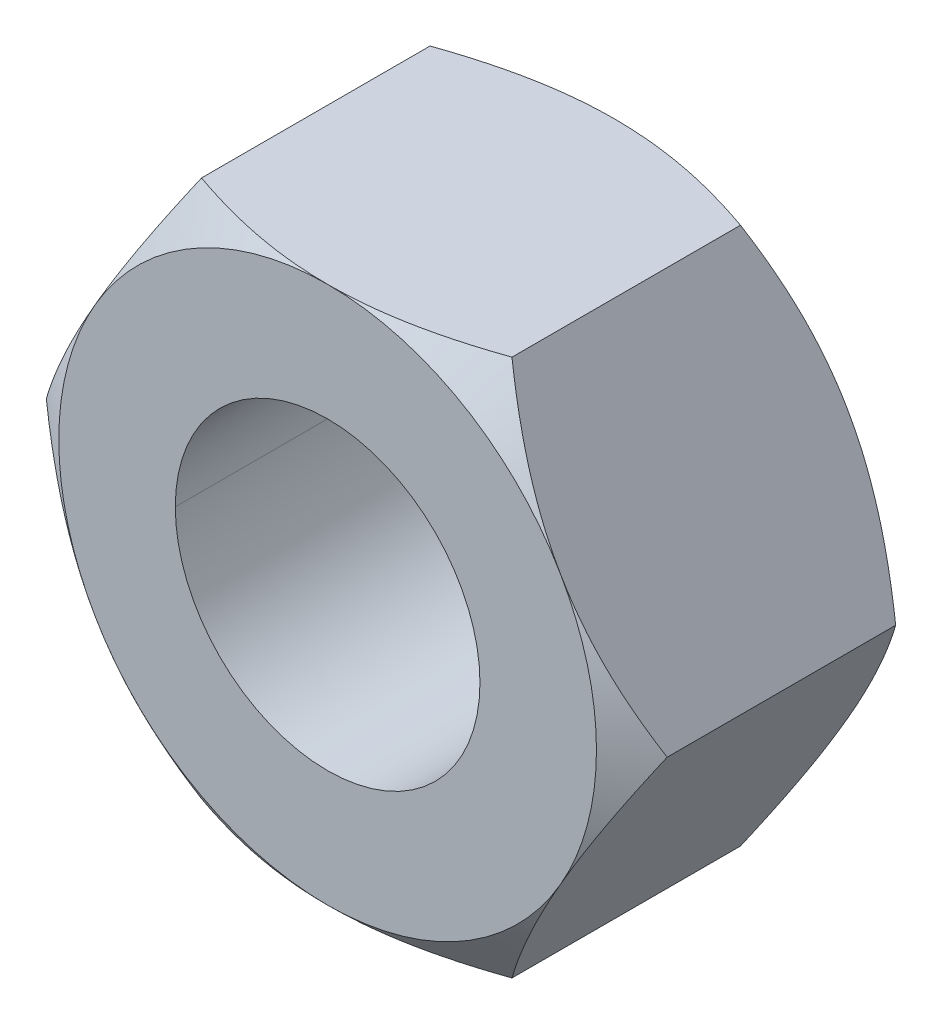
ISO-10303-21;
HEADER;
FILE_DESCRIPTION(('STEP AP214'),'2;1');
FILE_NAME('part.step','',(''),(''),'','','');
FILE_SCHEMA(('AUTOMOTIVE_DESIGN { 1 0 10303 214 1 1 1 1 }'));
ENDSEC;
DATA;
#1=APPLICATION_CONTEXT('core data for automotive mechanical design processes');
#2=APPLICATION_PROTOCOL_DEFINITION('international standard','automotive_design',2000,#1);
#3=PRODUCT_CONTEXT('',#1,'mechanical');
#4=PRODUCT('Part','Part','',(#3));
#5=PRODUCT_RELATED_PRODUCT_CATEGORY('part','',(#4));
#6=PRODUCT_DEFINITION_FORMATION('','',#4);
#7=PRODUCT_DEFINITION_CONTEXT('part definition',#1,'design');
#8=PRODUCT_DEFINITION('design','',#6,#7);
#9=PRODUCT_DEFINITION_SHAPE('','',#8);
#10=(LENGTH_UNIT() NAMED_UNIT(*) SI_UNIT(.MILLI.,.METRE.));
#11=(NAMED_UNIT(*) PLANE_ANGLE_UNIT() SI_UNIT($,.RADIAN.));
#12=(NAMED_UNIT(*) SI_UNIT($,.STERADIAN.) SOLID_ANGLE_UNIT());
#13=UNCERTAINTY_MEASURE_WITH_UNIT(LENGTH_MEASURE(1.E-05),#10,'distance_accuracy_value','');
#14=(GEOMETRIC_REPRESENTATION_CONTEXT(3) GLOBAL_UNCERTAINTY_ASSIGNED_CONTEXT((#13)) GLOBAL_UNIT_ASSIGNED_CONTEXT((#10,
#11,#12)) REPRESENTATION_CONTEXT('',''));
#15=CARTESIAN_POINT('',(0.,0.,0.));
#16=DIRECTION('',(0.,0.,1.));
#17=DIRECTION('',(1.,0.,0.));
#18=AXIS2_PLACEMENT_3D('',#15,#16,#17);
#19=CARTESIAN_POINT('',(1.732050807569,0.,0.08124186235412));
#20=DIRECTION('',(0.,0.,1.));
#21=DIRECTION('',(-1.,0.,0.));
#22=AXIS2_PLACEMENT_3D('',#19,#20,#21);
#23=CONICAL_SURFACE('',#22,1.616025403784,0.9599310885967);
#24=CARTESIAN_POINT('',(1.732050807611,1.5,2.086235252517E-13));
#25=CARTESIAN_POINT('',(1.52330238576711,1.5,2.086235252517E-13));
#26=CARTESIAN_POINT('',(1.30632687304829,1.5,0.0414770288528725));
#27=CARTESIAN_POINT('',(1.09779716156328,1.5,0.0813395587371093));
#28=CARTESIAN_POINT('',(0.8660254037845,1.5,0.1624837247076));
#29=B_SPLINE_CURVE_WITH_KNOTS('',2,(#24,#25,#26,#27,#28),.UNSPECIFIED.,.F.,.F.,(3,2,3),(0.,0.5,
1.),.UNSPECIFIED.);
#30=CARTESIAN_POINT('',(1.732050807597,1.5,3.814726312612E-13));
#31=VERTEX_POINT('',#30);
#32=CARTESIAN_POINT('',(0.8660254037845,1.5,0.1624837247076));
#33=VERTEX_POINT('',#32);
#34=EDGE_CURVE('E199',#31,#33,#29,.T.);
#35=ORIENTED_EDGE('',*,*,#34,.F.);
#36=CARTESIAN_POINT('',(1.732050807569,0.,4.285460875053E-13));
#37=DIRECTION('',(0.,0.,1.));
#38=DIRECTION('',(1.873005454437E-11,1.,0.));
#39=AXIS2_PLACEMENT_3D('',#36,#37,#38);
#40=CIRCLE('',#39,1.5);
#41=CARTESIAN_POINT('',(0.4330127019168,0.7500000000421,4.349853810481E-13));
#42=VERTEX_POINT('',#41);
#43=EDGE_CURVE('E268',#31,#42,#40,.T.);
#44=ORIENTED_EDGE('',*,*,#43,.T.);
#45=CARTESIAN_POINT('',(0.866025403784425,1.50000000000004,0.1624837247076));
#46=CARTESIAN_POINT('',(0.750302519965854,1.2995620856279,0.0814536891150306));
#47=CARTESIAN_POINT('',(0.64566544695967,1.1183253588259,0.0413974797374313));
#48=CARTESIAN_POINT('',(0.537524632418271,0.931019973668323,2.22017499870719E-13));
#49=CARTESIAN_POINT('',(0.433012701916569,0.750000000042275,2.220155437577E-13));
#50=B_SPLINE_CURVE_WITH_KNOTS('',2,(#45,#46,#47,#48,#49),.UNSPECIFIED.,.F.,.F.,(3,2,3),(0.,0.5,
1.),.UNSPECIFIED.);
#51=EDGE_CURVE('E203',#33,#42,#50,.T.);
#52=ORIENTED_EDGE('',*,*,#51,.F.);
#53=EDGE_LOOP('',(#35,#44,#52));
#54=FACE_BOUND('',#53,.T.);
#55=ADVANCED_FACE('F16',(#54),#23,.T.);
#56=CARTESIAN_POINT('',(1.732050807569,0.,0.08124186235399));
#57=DIRECTION('',(0.,0.,1.));
#58=DIRECTION('',(-1.,0.,0.));
#59=AXIS2_PLACEMENT_3D('',#56,#57,#58);
#60=CONICAL_SURFACE('',#59,1.616025403784,0.9599310885967);
#61=CARTESIAN_POINT('',(3.0310889132574,0.749999999979833,2.103710835714E-13));
#62=CARTESIAN_POINT('',(2.9267147023445,0.930781436280886,2.103710835714E-13));
#63=CARTESIAN_POINT('',(2.81822694598485,1.11868774229494,0.0414770288528081));
#64=CARTESIAN_POINT('',(2.71396209024344,1.2992797698829,0.0813395587364784));
#65=CARTESIAN_POINT('',(2.59807621135339,1.50000000000023,0.1624837247075));
#66=B_SPLINE_CURVE_WITH_KNOTS('',2,(#61,#62,#63,#64,#65),.UNSPECIFIED.,.F.,.F.,(3,2,3),(0.,0.5,
1.),.UNSPECIFIED.);
#67=CARTESIAN_POINT('',(3.031088913256,0.7499999999822,4.35429470258E-13));
#68=VERTEX_POINT('',#67);
#69=CARTESIAN_POINT('',(2.598076211353,1.5,0.1624837247075));
#70=VERTEX_POINT('',#69);
#71=EDGE_CURVE('E590',#68,#70,#66,.T.);
#72=ORIENTED_EDGE('',*,*,#71,.F.);
#73=CARTESIAN_POINT('',(1.732050807569,0.,3.814726312612E-13));
#74=DIRECTION('',(0.,0.,1.));
#75=DIRECTION('',(0.866025403791264,0.499999999988179,0.));
#76=AXIS2_PLACEMENT_3D('',#73,#74,#75);
#77=CIRCLE('',#76,1.5);
#78=EDGE_CURVE('E898',#68,#31,#77,.T.);
#79=ORIENTED_EDGE('',*,*,#78,.T.);
#80=CARTESIAN_POINT('',(2.598076211353,1.5,0.1624837247075));
#81=CARTESIAN_POINT('',(2.3666304437161,1.5,0.0814536891147999));
#82=CARTESIAN_POINT('',(2.15735629770348,1.5,0.0413974797372453));
#83=CARTESIAN_POINT('',(1.94107466862108,1.5,2.08620826776945E-13));
#84=CARTESIAN_POINT('',(1.732050807611,1.5,2.086235252517E-13));
#85=B_SPLINE_CURVE_WITH_KNOTS('',2,(#80,#81,#82,#83,#84),.UNSPECIFIED.,.F.,.F.,(3,2,3),(0.,0.5,
1.),.UNSPECIFIED.);
#86=EDGE_CURVE('E222',#70,#31,#85,.T.);
#87=ORIENTED_EDGE('',*,*,#86,.F.);
#88=EDGE_LOOP('',(#72,#79,#87));
#89=FACE_BOUND('',#88,.T.);
#90=ADVANCED_FACE('F277',(#89),#60,.T.);
#91=CARTESIAN_POINT('',(1.732050807569,0.,0.));
#92=DIRECTION('',(0.,0.,1.));
#93=DIRECTION('',(1.,0.,0.));
#94=AXIS2_PLACEMENT_3D('',#91,#92,#93);
#95=CYLINDRICAL_SURFACE('',#94,0.85);
#96=DIRECTION('',(0.,0.,1.));
#97=VECTOR('',#96,1.);
#98=CARTESIAN_POINT('',(2.582050807569,0.,0.));
#99=LINE('',#98,#97);
#100=CARTESIAN_POINT('',(2.582050807569,0.,0.));
#101=VERTEX_POINT('',#100);
#102=CARTESIAN_POINT('',(2.582050807569,0.,1.6));
#103=VERTEX_POINT('',#102);
#104=EDGE_CURVE('E11',#101,#103,#99,.T.);
#105=ORIENTED_EDGE('',*,*,#104,.T.);
#106=CARTESIAN_POINT('',(1.732050807569,0.,1.6));
#107=DIRECTION('',(0.,0.,1.));
#108=DIRECTION('',(1.,0.,0.));
#109=AXIS2_PLACEMENT_3D('',#106,#107,#108);
#110=CIRCLE('',#109,0.85);
#111=CARTESIAN_POINT('',(0.882050807569,0.,1.6));
#112=VERTEX_POINT('',#111);
#113=EDGE_CURVE('E559',#103,#112,#110,.T.);
#114=ORIENTED_EDGE('',*,*,#113,.T.);
#115=DIRECTION('',(0.,0.,1.));
#116=VECTOR('',#115,1.);
#117=CARTESIAN_POINT('',(0.882050807569,0.,0.));
#118=LINE('',#117,#116);
#119=CARTESIAN_POINT('',(0.882050807569,0.,0.));
#120=VERTEX_POINT('',#119);
#121=EDGE_CURVE('E30',#120,#112,#118,.T.);
#122=ORIENTED_EDGE('',*,*,#121,.F.);
#123=CARTESIAN_POINT('',(1.732050807569,0.,0.));
#124=DIRECTION('',(0.,0.,-1.));
#125=DIRECTION('',(-1.,0.,0.));
#126=AXIS2_PLACEMENT_3D('',#123,#124,#125);
#127=CIRCLE('',#126,0.85);
#128=EDGE_CURVE('E297',#120,#101,#127,.T.);
#129=ORIENTED_EDGE('',*,*,#128,.T.);
#130=EDGE_LOOP('',(#105,#114,#122,#129));
#131=FACE_BOUND('',#130,.T.);
#132=ADVANCED_FACE('F239',(#131),#95,.F.);
#133=CARTESIAN_POINT('',(1.732050807569,0.,0.));
#134=DIRECTION('',(0.,0.,1.));
#135=DIRECTION('',(1.,0.,0.));
#136=AXIS2_PLACEMENT_3D('',#133,#134,#135);
#137=CYLINDRICAL_SURFACE('',#136,0.85);
#138=ORIENTED_EDGE('',*,*,#121,.T.);
#139=CARTESIAN_POINT('',(1.732050807569,0.,1.6));
#140=DIRECTION('',(0.,0.,1.));
#141=DIRECTION('',(-1.,0.,0.));
#142=AXIS2_PLACEMENT_3D('',#139,#140,#141);
#143=CIRCLE('',#142,0.85);
#144=EDGE_CURVE('E549',#112,#103,#143,.T.);
#145=ORIENTED_EDGE('',*,*,#144,.T.);
#146=ORIENTED_EDGE('',*,*,#104,.F.);
#147=CARTESIAN_POINT('',(1.732050807569,0.,0.));
#148=DIRECTION('',(0.,0.,-1.));
#149=DIRECTION('',(1.,0.,0.));
#150=AXIS2_PLACEMENT_3D('',#147,#148,#149);
#151=CIRCLE('',#150,0.85);
#152=EDGE_CURVE('E600',#101,#120,#151,.T.);
#153=ORIENTED_EDGE('',*,*,#152,.T.);
#154=EDGE_LOOP('',(#138,#145,#146,#153));
#155=FACE_BOUND('',#154,.T.);
#156=ADVANCED_FACE('F278',(#155),#137,.F.);
#157=CARTESIAN_POINT('',(1.732050807569,0.,0.08124186235412));
#158=DIRECTION('',(0.,0.,1.));
#159=DIRECTION('',(-1.,0.,0.));
#160=AXIS2_PLACEMENT_3D('',#157,#158,#159);
#161=CONICAL_SURFACE('',#160,1.616025403784,0.9599310885967);
#162=CARTESIAN_POINT('',(0.433012701880496,-0.74999999997966,2.221409478571E-13));
#163=CARTESIAN_POINT('',(0.5373869127955,-0.93078143628435,2.221409478571E-13));
#164=CARTESIAN_POINT('',(0.645874669157564,-1.11868774230259,0.04147702885462));
#165=CARTESIAN_POINT('',(0.750139524894891,-1.29927976988347,0.0813395587375678));
#166=CARTESIAN_POINT('',(0.866025403784484,-1.50000000000001,0.1624837247076));
#167=B_SPLINE_CURVE_WITH_KNOTS('',2,(#162,#163,#164,#165,#166),.UNSPECIFIED.,.F.,.F.,(3,2,3),
(0.,0.5,1.),.UNSPECIFIED.);
#168=CARTESIAN_POINT('',(0.4330127018823,-0.7499999999823,4.35429470258E-13));
#169=VERTEX_POINT('',#168);
#170=CARTESIAN_POINT('',(0.8660254037845,-1.5,0.1624837247076));
#171=VERTEX_POINT('',#170);
#172=EDGE_CURVE('E548',#169,#171,#167,.T.);
#173=ORIENTED_EDGE('',*,*,#172,.F.);
#174=CARTESIAN_POINT('',(1.732050807569,0.,4.285460875053E-13));
#175=DIRECTION('',(0.,0.,1.));
#176=DIRECTION('',(-0.866025403791239,-0.499999999988222,0.));
#177=AXIS2_PLACEMENT_3D('',#174,#175,#176);
#178=CIRCLE('',#177,1.5);
#179=CARTESIAN_POINT('',(1.73205080754,-1.5,4.285460875053E-13));
#180=VERTEX_POINT('',#179);
#181=EDGE_CURVE('E471',#169,#180,#178,.T.);
#182=ORIENTED_EDGE('',*,*,#181,.T.);
#183=CARTESIAN_POINT('',(0.8660254037845,-1.5,0.1624837247076));
#184=CARTESIAN_POINT('',(1.097471171419,-1.5,0.0814536891154175));
#185=CARTESIAN_POINT('',(1.30674531743504,-1.5,0.0413974797372249));
#186=CARTESIAN_POINT('',(1.52302694651742,-1.5,2.08620826776945E-13));
#187=CARTESIAN_POINT('',(1.732050807526,-1.5,2.086238902452E-13));
#188=B_SPLINE_CURVE_WITH_KNOTS('',2,(#183,#184,#185,#186,#187),.UNSPECIFIED.,.F.,.F.,(3,2,3),
(0.,0.5,1.),.UNSPECIFIED.);
#189=EDGE_CURVE('E485',#171,#180,#188,.T.);
#190=ORIENTED_EDGE('',*,*,#189,.F.);
#191=EDGE_LOOP('',(#173,#182,#190));
#192=FACE_BOUND('',#191,.T.);
#193=ADVANCED_FACE('F502',(#192),#161,.T.);
#194=CARTESIAN_POINT('',(1.732050807569,0.,0.08124186235399));
#195=DIRECTION('',(0.,0.,1.));
#196=DIRECTION('',(-1.,0.,0.));
#197=AXIS2_PLACEMENT_3D('',#194,#195,#196);
#198=CONICAL_SURFACE('',#197,1.616025403784,0.9599310885967);
#199=CARTESIAN_POINT('',(1.732050807526,-1.5,2.086238902452E-13));
#200=CARTESIAN_POINT('',(1.94079922937041,-1.5,2.086238902452E-13));
#201=CARTESIAN_POINT('',(2.15777474208827,-1.5,0.0414770288525354));
#202=CARTESIAN_POINT('',(2.36630445357044,-1.5,0.0813395587360802));
#203=CARTESIAN_POINT('',(2.598076211353,-1.5,0.1624837247075));
#204=B_SPLINE_CURVE_WITH_KNOTS('',2,(#199,#200,#201,#202,#203),.UNSPECIFIED.,.F.,.F.,(3,2,3),
(0.,0.5,1.),.UNSPECIFIED.);
#205=CARTESIAN_POINT('',(2.598076211353,-1.5,0.1624837247075));
#206=VERTEX_POINT('',#205);
#207=EDGE_CURVE('E456',#180,#206,#204,.T.);
#208=ORIENTED_EDGE('',*,*,#207,.F.);
#209=CARTESIAN_POINT('',(1.732050807569,0.,3.814726312612E-13));
#210=DIRECTION('',(0.,0.,1.));
#211=DIRECTION('',(-1.923172732177E-11,-1.,0.));
#212=AXIS2_PLACEMENT_3D('',#209,#210,#211);
#213=CIRCLE('',#212,1.5);
#214=CARTESIAN_POINT('',(3.031088913221,-0.7500000000424,3.814726312612E-13));
#215=VERTEX_POINT('',#214);
#216=EDGE_CURVE('E480',#180,#215,#213,.T.);
#217=ORIENTED_EDGE('',*,*,#216,.T.);
#218=CARTESIAN_POINT('',(2.598076211353,-1.5,0.1624837247075));
#219=CARTESIAN_POINT('',(2.71379909516934,-1.29956208563171,0.0814536891155919));
#220=CARTESIAN_POINT('',(2.81843616817756,-1.1183253588262,0.0413974797373702));
#221=CARTESIAN_POINT('',(2.92657698271925,-0.931019973668119,2.1043008915228E-13));
#222=CARTESIAN_POINT('',(3.03108891322082,-0.750000000042295,2.104270285076E-13));
#223=B_SPLINE_CURVE_WITH_KNOTS('',2,(#218,#219,#220,#221,#222),.UNSPECIFIED.,.F.,.F.,(3,2,3),
(0.,0.5,1.),.UNSPECIFIED.);
#224=EDGE_CURVE('E563',#206,#215,#223,.T.);
#225=ORIENTED_EDGE('',*,*,#224,.F.);
#226=EDGE_LOOP('',(#208,#217,#225));
#227=FACE_BOUND('',#226,.T.);
#228=ADVANCED_FACE('F279',(#227),#198,.T.);
#229=CARTESIAN_POINT('',(1.732050807569,0.,0.08124186235414));
#230=DIRECTION('',(0.,0.,1.));
#231=DIRECTION('',(-1.,0.,0.));
#232=AXIS2_PLACEMENT_3D('',#229,#230,#231);
#233=CONICAL_SURFACE('',#232,1.616025403784,0.9599310885967);
#234=CARTESIAN_POINT('',(1.732050807569,0.,4.356515148629E-13));
#235=DIRECTION('',(0.,0.,1.));
#236=DIRECTION('',(0.8660254037681,-0.5000000000283,0.));
#237=AXIS2_PLACEMENT_3D('',#234,#235,#236);
#238=CIRCLE('',#237,1.5);
#239=CARTESIAN_POINT('',(3.232050807569,0.,4.356515148629E-13));
#240=VERTEX_POINT('',#239);
#241=EDGE_CURVE('E598',#215,#240,#238,.T.);
#242=ORIENTED_EDGE('',*,*,#241,.T.);
#243=CARTESIAN_POINT('',(1.732050807569,0.,4.35429470258E-13));
#244=DIRECTION('',(0.,0.,1.));
#245=DIRECTION('',(1.,0.,0.));
#246=AXIS2_PLACEMENT_3D('',#243,#244,#245);
#247=CIRCLE('',#246,1.5);
#248=EDGE_CURVE('E894',#240,#68,#247,.T.);
#249=ORIENTED_EDGE('',*,*,#248,.T.);
#250=CARTESIAN_POINT('',(3.46410161513794,1.03645394788801E-13,0.1624837247076));
#251=CARTESIAN_POINT('',(3.34837873131445,0.200437914380765,0.0814536891114334));
#252=CARTESIAN_POINT('',(3.24374165830216,0.38167464119335,0.0413974797330722));
#253=CARTESIAN_POINT('',(3.13560084376785,0.568980026338638,2.10369102780078E-13));
#254=CARTESIAN_POINT('',(3.0310889132574,0.749999999979833,2.103710835714E-13));
#255=B_SPLINE_CURVE_WITH_KNOTS('',2,(#250,#251,#252,#253,#254),.UNSPECIFIED.,.F.,.F.,(3,2,3),
(0.,0.5,1.),.UNSPECIFIED.);
#256=CARTESIAN_POINT('',(3.464101615138,1.381874985966E-13,0.1624837247076));
#257=VERTEX_POINT('',#256);
#258=EDGE_CURVE('E575',#257,#68,#255,.T.);
#259=ORIENTED_EDGE('',*,*,#258,.F.);
#260=CARTESIAN_POINT('',(3.03108891322082,-0.750000000042295,2.104270285076E-13));
#261=CARTESIAN_POINT('',(3.13546312414541,-0.569218563721009,2.104270285076E-13));
#262=CARTESIAN_POINT('',(3.243950880504,-0.381312257708787,0.0414770288521788));
#263=CARTESIAN_POINT('',(3.34821573624655,-0.200720230118851,0.0813395587360672));
#264=CARTESIAN_POINT('',(3.46410161513767,3.31982705215061E-13,0.1624837247076));
#265=B_SPLINE_CURVE_WITH_KNOTS('',2,(#260,#261,#262,#263,#264),.UNSPECIFIED.,.F.,.F.,(3,2,3),
(0.,0.5,1.),.UNSPECIFIED.);
#266=EDGE_CURVE('E583',#215,#257,#265,.T.);
#267=ORIENTED_EDGE('',*,*,#266,.F.);
#268=EDGE_LOOP('',(#242,#249,#259,#267));
#269=FACE_BOUND('',#268,.T.);
#270=ADVANCED_FACE('F389',(#269),#233,.T.);
#271=CARTESIAN_POINT('',(2.598076211353,-1.5,0.));
#272=DIRECTION('',(0.866025403784429,-0.500000000000017,0.));
#273=DIRECTION('',(0.,0.,-1.));
#274=AXIS2_PLACEMENT_3D('',#271,#272,#273);
#275=PLANE('',#274);
#276=DIRECTION('',(0.,0.,1.));
#277=VECTOR('',#276,1.);
#278=CARTESIAN_POINT('',(2.598076211353,-1.5,0.1624837247075));
#279=LINE('',#278,#277);
#280=CARTESIAN_POINT('',(2.598076211353,-1.5,1.437516275293));
#281=VERTEX_POINT('',#280);
#282=EDGE_CURVE('E861',#206,#281,#279,.T.);
#283=ORIENTED_EDGE('',*,*,#282,.F.);
#284=ORIENTED_EDGE('',*,*,#224,.T.);
#285=ORIENTED_EDGE('',*,*,#266,.T.);
#286=DIRECTION('',(0.,0.,1.));
#287=VECTOR('',#286,1.);
#288=CARTESIAN_POINT('',(3.464101615138,1.381874985966E-13,0.1624837247076));
#289=LINE('',#288,#287);
#290=CARTESIAN_POINT('',(3.464101615138,1.131314911771E-13,1.437516275293));
#291=VERTEX_POINT('',#290);
#292=EDGE_CURVE('E572',#257,#291,#289,.T.);
#293=ORIENTED_EDGE('',*,*,#292,.T.);
#294=CARTESIAN_POINT('',(3.46410161513766,3.10081821330854E-13,1.437516275293));
#295=CARTESIAN_POINT('',(3.34837899239823,-0.200437462169488,1.51854612807624));
#296=CARTESIAN_POINT('',(3.24374180005769,-0.381674395664659,1.55860242086054));
#297=CARTESIAN_POINT('',(3.13560082769726,-0.568980054172819,1.6));
#298=CARTESIAN_POINT('',(3.03108891322777,-0.750000000030264,1.6));
#299=B_SPLINE_CURVE_WITH_KNOTS('',2,(#294,#295,#296,#297,#298),.UNSPECIFIED.,.F.,.F.,(3,2,3),
(0.,0.5,1.),.UNSPECIFIED.);
#300=CARTESIAN_POINT('',(3.031088913237,-0.7500000000146,1.6));
#301=VERTEX_POINT('',#300);
#302=EDGE_CURVE('E374',#291,#301,#299,.T.);
#303=ORIENTED_EDGE('',*,*,#302,.T.);
#304=CARTESIAN_POINT('',(3.03108891322777,-0.750000000030264,1.6));
#305=CARTESIAN_POINT('',(2.92671472376102,-0.930781399185483,1.6));
#306=CARTESIAN_POINT('',(2.81822706865502,-1.11868752982308,1.55852306377746));
#307=CARTESIAN_POINT('',(2.71396239712162,-1.29927923835339,1.51866065614011));
#308=CARTESIAN_POINT('',(2.598076211353,-1.5,1.437516275293));
#309=B_SPLINE_CURVE_WITH_KNOTS('',2,(#304,#305,#306,#307,#308),.UNSPECIFIED.,.F.,.F.,(3,2,3),
(0.,0.5,1.),.UNSPECIFIED.);
#310=EDGE_CURVE('E44',#301,#281,#309,.T.);
#311=ORIENTED_EDGE('',*,*,#310,.T.);
#312=EDGE_LOOP('',(#283,#284,#285,#293,#303,#311));
#313=FACE_BOUND('',#312,.T.);
#314=ADVANCED_FACE('F379',(#313),#275,.T.);
#315=CARTESIAN_POINT('',(1.732050807569,0.,1.518758137646));
#316=DIRECTION('',(0.,0.,-1.));
#317=DIRECTION('',(1.,0.,0.));
#318=AXIS2_PLACEMENT_3D('',#315,#316,#317);
#319=CONICAL_SURFACE('',#318,1.616025403784,0.9599310885967);
#320=CARTESIAN_POINT('',(1.732050807569,0.,1.6));
#321=DIRECTION('',(0.,0.,-1.));
#322=DIRECTION('',(0.866025403778742,-0.500000000009867,0.));
#323=AXIS2_PLACEMENT_3D('',#320,#321,#322);
#324=CIRCLE('',#323,1.5);
#325=CARTESIAN_POINT('',(1.73205080754,-1.5,1.6));
#326=VERTEX_POINT('',#325);
#327=EDGE_CURVE('E422',#301,#326,#324,.T.);
#328=ORIENTED_EDGE('',*,*,#327,.T.);
#329=CARTESIAN_POINT('',(2.598076211353,-1.5,1.437516275293));
#330=CARTESIAN_POINT('',(2.3666309658683,-1.5,1.51854612807786));
#331=CARTESIAN_POINT('',(2.15735658118673,-1.5,1.55860242086156));
#332=CARTESIAN_POINT('',(1.94107463646748,-1.5,1.6));
#333=CARTESIAN_POINT('',(1.732050807526,-1.5,1.6));
#334=B_SPLINE_CURVE_WITH_KNOTS('',2,(#329,#330,#331,#332,#333),.UNSPECIFIED.,.F.,.F.,(3,2,3),
(0.,0.5,1.),.UNSPECIFIED.);
#335=EDGE_CURVE('E564',#281,#326,#334,.T.);
#336=ORIENTED_EDGE('',*,*,#335,.F.);
#337=ORIENTED_EDGE('',*,*,#310,.F.);
#338=EDGE_LOOP('',(#328,#336,#337));
#339=FACE_BOUND('',#338,.T.);
#340=ADVANCED_FACE('F388',(#339),#319,.T.);
#341=CARTESIAN_POINT('',(0.8660254037844,-1.5,0.));
#342=DIRECTION('',(0.,-1.,0.));
#343=DIRECTION('',(0.,0.,-1.));
#344=AXIS2_PLACEMENT_3D('',#341,#342,#343);
#345=PLANE('',#344);
#346=DIRECTION('',(0.,0.,1.));
#347=VECTOR('',#346,1.);
#348=CARTESIAN_POINT('',(0.8660254037845,-1.5,0.1624837247076));
#349=LINE('',#348,#347);
#350=CARTESIAN_POINT('',(0.8660254037846,-1.5,1.437516275293));
#351=VERTEX_POINT('',#350);
#352=EDGE_CURVE('E500',#171,#351,#349,.T.);
#353=ORIENTED_EDGE('',*,*,#352,.F.);
#354=ORIENTED_EDGE('',*,*,#189,.T.);
#355=ORIENTED_EDGE('',*,*,#207,.T.);
#356=ORIENTED_EDGE('',*,*,#282,.T.);
#357=ORIENTED_EDGE('',*,*,#335,.T.);
#358=CARTESIAN_POINT('',(1.732050807526,-1.5,1.6));
#359=CARTESIAN_POINT('',(1.52330242860801,-1.5,1.6));
#360=CARTESIAN_POINT('',(1.30632711839817,-1.5,1.55852306377846));
#361=CARTESIAN_POINT('',(1.09779777531797,-1.5,1.51866065613912));
#362=CARTESIAN_POINT('',(0.8660254037846,-1.5,1.437516275293));
#363=B_SPLINE_CURVE_WITH_KNOTS('',2,(#358,#359,#360,#361,#362),.UNSPECIFIED.,.F.,.F.,(3,2,3),
(0.,0.5,1.),.UNSPECIFIED.);
#364=EDGE_CURVE('E580',#326,#351,#363,.T.);
#365=ORIENTED_EDGE('',*,*,#364,.T.);
#366=EDGE_LOOP('',(#353,#354,#355,#356,#357,#365));
#367=FACE_BOUND('',#366,.T.);
#368=ADVANCED_FACE('F241',(#367),#345,.T.);
#369=CARTESIAN_POINT('',(1.732050807569,0.,1.518758137646));
#370=DIRECTION('',(0.,0.,-1.));
#371=DIRECTION('',(1.,0.,0.));
#372=AXIS2_PLACEMENT_3D('',#369,#370,#371);
#373=CONICAL_SURFACE('',#372,1.616025403784,0.9599310885967);
#374=CARTESIAN_POINT('',(1.732050807569,0.,1.6));
#375=DIRECTION('',(0.,0.,-1.));
#376=DIRECTION('',(-1.923039505414E-11,-1.,0.));
#377=AXIS2_PLACEMENT_3D('',#374,#375,#376);
#378=CIRCLE('',#377,1.5);
#379=CARTESIAN_POINT('',(0.433012701881,-0.7499999999798,1.6));
#380=VERTEX_POINT('',#379);
#381=EDGE_CURVE('E439',#326,#380,#378,.T.);
#382=ORIENTED_EDGE('',*,*,#381,.T.);
#383=CARTESIAN_POINT('',(0.866025403784509,-1.50000000000005,1.437516275293));
#384=CARTESIAN_POINT('',(0.750302781039503,-1.29956253782059,1.5185461280785));
#385=CARTESIAN_POINT('',(0.645665588701766,-1.11832560433028,1.55860242086104));
#386=CARTESIAN_POINT('',(0.537524616340805,-0.931019945821201,1.6));
#387=CARTESIAN_POINT('',(0.433012701879895,-0.749999999978619,1.6));
#388=B_SPLINE_CURVE_WITH_KNOTS('',2,(#383,#384,#385,#386,#387),.UNSPECIFIED.,.F.,.F.,(3,2,3),
(0.,0.5,1.),.UNSPECIFIED.);
#389=EDGE_CURVE('E543',#351,#380,#388,.T.);
#390=ORIENTED_EDGE('',*,*,#389,.F.);
#391=ORIENTED_EDGE('',*,*,#364,.F.);
#392=EDGE_LOOP('',(#382,#390,#391));
#393=FACE_BOUND('',#392,.T.);
#394=ADVANCED_FACE('F18',(#393),#373,.T.);
#395=CARTESIAN_POINT('',(0.,0.,0.));
#396=DIRECTION('',(-0.866025403784429,-0.500000000000017,0.));
#397=DIRECTION('',(-0.500000000000017,0.866025403784429,0.));
#398=AXIS2_PLACEMENT_3D('',#395,#396,#397);
#399=PLANE('',#398);
#400=DIRECTION('',(0.,0.,1.));
#401=VECTOR('',#400,1.);
#402=CARTESIAN_POINT('',(0.,0.,0.1624837247076));
#403=LINE('',#402,#401);
#404=CARTESIAN_POINT('',(0.,0.,0.1624837247076));
#405=VERTEX_POINT('',#404);
#406=CARTESIAN_POINT('',(1.995417098451E-13,0.,1.437516275293));
#407=VERTEX_POINT('',#406);
#408=EDGE_CURVE('E210',#405,#407,#403,.T.);
#409=ORIENTED_EDGE('',*,*,#408,.F.);
#410=CARTESIAN_POINT('',(0.,0.,0.1624837247076));
#411=CARTESIAN_POINT('',(0.115722883821684,-0.200437914377539,0.0814536891123308));
#412=CARTESIAN_POINT('',(0.220359956833204,-0.381674641188776,0.0413974797340645));
#413=CARTESIAN_POINT('',(0.32850077136952,-0.56898002633755,2.22139472615124E-13));
#414=CARTESIAN_POINT('',(0.433012701880496,-0.74999999997966,2.221409478571E-13));
#415=B_SPLINE_CURVE_WITH_KNOTS('',2,(#410,#411,#412,#413,#414),.UNSPECIFIED.,.F.,.F.,(3,2,3),
(0.,0.5,1.),.UNSPECIFIED.);
#416=EDGE_CURVE('E213',#405,#169,#415,.T.);
#417=ORIENTED_EDGE('',*,*,#416,.T.);
#418=ORIENTED_EDGE('',*,*,#172,.T.);
#419=ORIENTED_EDGE('',*,*,#352,.T.);
#420=ORIENTED_EDGE('',*,*,#389,.T.);
#421=CARTESIAN_POINT('',(0.433012701879895,-0.749999999978619,1.6));
#422=CARTESIAN_POINT('',(0.328638512413081,-0.569218600823286,1.6));
#423=CARTESIAN_POINT('',(0.22015085731189,-0.381312470194022,1.55852306378102));
#424=CARTESIAN_POINT('',(0.115886185771765,-0.200720761652054,1.51866065614276));
#425=CARTESIAN_POINT('',(0.,0.,1.437516275293));
#426=B_SPLINE_CURVE_WITH_KNOTS('',2,(#421,#422,#423,#424,#425),.UNSPECIFIED.,.F.,.F.,(3,2,3),
(0.,0.5,1.),.UNSPECIFIED.);
#427=EDGE_CURVE('E532',#380,#407,#426,.T.);
#428=ORIENTED_EDGE('',*,*,#427,.T.);
#429=EDGE_LOOP('',(#409,#417,#418,#419,#420,#428));
#430=FACE_BOUND('',#429,.T.);
#431=ADVANCED_FACE('F319',(#430),#399,.T.);
#432=CARTESIAN_POINT('',(1.732050807569,0.,1.518758137646));
#433=DIRECTION('',(0.,0.,-1.));
#434=DIRECTION('',(1.,0.,0.));
#435=AXIS2_PLACEMENT_3D('',#432,#433,#434);
#436=CONICAL_SURFACE('',#435,1.616025403784,0.9599310885967);
#437=CARTESIAN_POINT('',(0.,1.35742111995185E-13,1.437516275293));
#438=CARTESIAN_POINT('',(0.115722622741259,0.200437462173113,1.5185461280769));
#439=CARTESIAN_POINT('',(0.220359815083754,0.381674395671662,1.55860242086154));
#440=CARTESIAN_POINT('',(0.328500787442652,0.568980054177166,1.6));
#441=CARTESIAN_POINT('',(0.433012701909604,0.750000000030212,1.6));
#442=B_SPLINE_CURVE_WITH_KNOTS('',2,(#437,#438,#439,#440,#441),.UNSPECIFIED.,.F.,.F.,(3,2,3),
(0.,0.5,1.),.UNSPECIFIED.);
#443=CARTESIAN_POINT('',(0.4330127019098,0.7500000000301,1.6));
#444=VERTEX_POINT('',#443);
#445=EDGE_CURVE('E192',#407,#444,#442,.T.);
#446=ORIENTED_EDGE('',*,*,#445,.F.);
#447=ORIENTED_EDGE('',*,*,#427,.F.);
#448=CARTESIAN_POINT('',(1.732050807569,0.,1.6));
#449=DIRECTION('',(0.,0.,-1.));
#450=DIRECTION('',(-0.866025403792181,-0.499999999986589,0.));
#451=AXIS2_PLACEMENT_3D('',#448,#449,#450);
#452=CIRCLE('',#451,1.5);
#453=CARTESIAN_POINT('',(0.2320508075693,0.,1.6));
#454=VERTEX_POINT('',#453);
#455=EDGE_CURVE('E828',#380,#454,#452,.T.);
#456=ORIENTED_EDGE('',*,*,#455,.T.);
#457=CARTESIAN_POINT('',(1.732050807569,0.,1.6));
#458=DIRECTION('',(0.,0.,-1.));
#459=DIRECTION('',(-1.,0.,0.));
#460=AXIS2_PLACEMENT_3D('',#457,#458,#459);
#461=CIRCLE('',#460,1.5);
#462=EDGE_CURVE('E551',#454,#444,#461,.T.);
#463=ORIENTED_EDGE('',*,*,#462,.T.);
#464=EDGE_LOOP('',(#446,#447,#456,#463));
#465=FACE_BOUND('',#464,.T.);
#466=ADVANCED_FACE('F342',(#465),#436,.T.);
#467=CARTESIAN_POINT('',(0.,0.,1.6));
#468=DIRECTION('',(0.,0.,1.));
#469=DIRECTION('',(1.,0.,0.));
#470=AXIS2_PLACEMENT_3D('',#467,#468,#469);
#471=PLANE('',#470);
#472=ORIENTED_EDGE('',*,*,#113,.F.);
#473=ORIENTED_EDGE('',*,*,#144,.F.);
#474=EDGE_LOOP('',(#472,#473));
#475=FACE_BOUND('',#474,.T.);
#476=ORIENTED_EDGE('',*,*,#381,.F.);
#477=ORIENTED_EDGE('',*,*,#327,.F.);
#478=CARTESIAN_POINT('',(1.732050807569,0.,1.6));
#479=DIRECTION('',(0.,0.,-1.));
#480=DIRECTION('',(1.,0.,0.));
#481=AXIS2_PLACEMENT_3D('',#478,#479,#480);
#482=CIRCLE('',#481,1.5);
#483=CARTESIAN_POINT('',(3.232050807569,0.,1.6));
#484=VERTEX_POINT('',#483);
#485=EDGE_CURVE('E448',#484,#301,#482,.T.);
#486=ORIENTED_EDGE('',*,*,#485,.F.);
#487=CARTESIAN_POINT('',(1.732050807569,0.,1.6));
#488=DIRECTION('',(0.,0.,-1.));
#489=DIRECTION('',(0.866025403792181,0.499999999986589,0.));
#490=AXIS2_PLACEMENT_3D('',#487,#488,#489);
#491=CIRCLE('',#490,1.5);
#492=CARTESIAN_POINT('',(3.031088913258,0.7499999999786,1.6));
#493=VERTEX_POINT('',#492);
#494=EDGE_CURVE('E607',#493,#484,#491,.T.);
#495=ORIENTED_EDGE('',*,*,#494,.F.);
#496=CARTESIAN_POINT('',(1.732050807569,0.,1.6));
#497=DIRECTION('',(0.,0.,-1.));
#498=DIRECTION('',(1.873020257411E-11,1.,0.));
#499=AXIS2_PLACEMENT_3D('',#496,#497,#498);
#500=CIRCLE('',#499,1.5);
#501=CARTESIAN_POINT('',(1.732050807611,1.5,1.6));
#502=VERTEX_POINT('',#501);
#503=EDGE_CURVE('E565',#502,#493,#500,.T.);
#504=ORIENTED_EDGE('',*,*,#503,.F.);
#505=CARTESIAN_POINT('',(1.732050807569,0.,1.6));
#506=DIRECTION('',(0.,0.,-1.));
#507=DIRECTION('',(-0.866025403778786,0.500000000009792,0.));
#508=AXIS2_PLACEMENT_3D('',#505,#506,#507);
#509=CIRCLE('',#508,1.5);
#510=EDGE_CURVE('E176',#444,#502,#509,.T.);
#511=ORIENTED_EDGE('',*,*,#510,.F.);
#512=ORIENTED_EDGE('',*,*,#462,.F.);
#513=ORIENTED_EDGE('',*,*,#455,.F.);
#514=EDGE_LOOP('',(#476,#477,#486,#495,#504,#511,#512,#513));
#515=FACE_BOUND('',#514,.T.);
#516=ADVANCED_FACE('F351',(#475,#515),#471,.T.);
#517=CARTESIAN_POINT('',(1.732050807569,0.,1.518758137646));
#518=DIRECTION('',(0.,0.,-1.));
#519=DIRECTION('',(1.,0.,0.));
#520=AXIS2_PLACEMENT_3D('',#517,#518,#519);
#521=CONICAL_SURFACE('',#520,1.616025403784,0.9599310885967);
#522=ORIENTED_EDGE('',*,*,#302,.F.);
#523=CARTESIAN_POINT('',(3.03108891325809,0.74999999997865,1.6));
#524=CARTESIAN_POINT('',(3.13546310272632,0.569218600820861,1.6));
#525=CARTESIAN_POINT('',(3.2439507578266,0.381312470193179,1.55852306378054));
#526=CARTESIAN_POINT('',(3.34821542936733,0.200720761650148,1.51866065614125));
#527=CARTESIAN_POINT('',(3.46410161513795,0.,1.437516275293));
#528=B_SPLINE_CURVE_WITH_KNOTS('',2,(#523,#524,#525,#526,#527),.UNSPECIFIED.,.F.,.F.,(3,2,3),
(0.,0.5,1.),.UNSPECIFIED.);
#529=EDGE_CURVE('E586',#493,#291,#528,.T.);
#530=ORIENTED_EDGE('',*,*,#529,.F.);
#531=ORIENTED_EDGE('',*,*,#494,.T.);
#532=ORIENTED_EDGE('',*,*,#485,.T.);
#533=EDGE_LOOP('',(#522,#530,#531,#532));
#534=FACE_BOUND('',#533,.T.);
#535=ADVANCED_FACE('F665',(#534),#521,.T.);
#536=CARTESIAN_POINT('',(3.464101615138,0.,0.));
#537=DIRECTION('',(0.866025403784429,0.500000000000017,0.));
#538=DIRECTION('',(0.,0.,-1.));
#539=AXIS2_PLACEMENT_3D('',#536,#537,#538);
#540=PLANE('',#539);
#541=ORIENTED_EDGE('',*,*,#292,.F.);
#542=ORIENTED_EDGE('',*,*,#258,.T.);
#543=ORIENTED_EDGE('',*,*,#71,.T.);
#544=DIRECTION('',(0.,0.,1.));
#545=VECTOR('',#544,1.);
#546=CARTESIAN_POINT('',(2.598076211353,1.5,0.1624837247075));
#547=LINE('',#546,#545);
#548=CARTESIAN_POINT('',(2.598076211353,1.5,1.437516275293));
#549=VERTEX_POINT('',#548);
#550=EDGE_CURVE('E182',#70,#549,#547,.T.);
#551=ORIENTED_EDGE('',*,*,#550,.T.);
#552=CARTESIAN_POINT('',(2.59807621135339,1.50000000000023,1.437516275293));
#553=CARTESIAN_POINT('',(2.71379883409784,1.29956253782173,1.51854612807855));
#554=CARTESIAN_POINT('',(2.81843602643561,1.11832560433136,1.55860242086104));
#555=CARTESIAN_POINT('',(2.92657699879674,0.931019945821989,1.6));
#556=CARTESIAN_POINT('',(3.03108891325809,0.74999999997865,1.6));
#557=B_SPLINE_CURVE_WITH_KNOTS('',2,(#552,#553,#554,#555,#556),.UNSPECIFIED.,.F.,.F.,(3,2,3),
(0.,0.5,1.),.UNSPECIFIED.);
#558=EDGE_CURVE('E569',#549,#493,#557,.T.);
#559=ORIENTED_EDGE('',*,*,#558,.T.);
#560=ORIENTED_EDGE('',*,*,#529,.T.);
#561=EDGE_LOOP('',(#541,#542,#543,#551,#559,#560));
#562=FACE_BOUND('',#561,.T.);
#563=ADVANCED_FACE('F674',(#562),#540,.T.);
#564=CARTESIAN_POINT('',(1.732050807569,0.,1.518758137646));
#565=DIRECTION('',(0.,0.,-1.));
#566=DIRECTION('',(1.,0.,0.));
#567=AXIS2_PLACEMENT_3D('',#564,#565,#566);
#568=CONICAL_SURFACE('',#567,1.616025403784,0.9599310885967);
#569=ORIENTED_EDGE('',*,*,#503,.T.);
#570=ORIENTED_EDGE('',*,*,#558,.F.);
#571=CARTESIAN_POINT('',(1.732050807611,1.5,1.6));
#572=CARTESIAN_POINT('',(1.94079918652993,1.5,1.6));
#573=CARTESIAN_POINT('',(2.15777449674035,1.5,1.55852306377894));
#574=CARTESIAN_POINT('',(2.36630383981828,1.5,1.5186606561406));
#575=CARTESIAN_POINT('',(2.598076211353,1.5,1.437516275293));
#576=B_SPLINE_CURVE_WITH_KNOTS('',2,(#571,#572,#573,#574,#575),.UNSPECIFIED.,.F.,.F.,(3,2,3),
(0.,0.5,1.),.UNSPECIFIED.);
#577=EDGE_CURVE('E570',#502,#549,#576,.T.);
#578=ORIENTED_EDGE('',*,*,#577,.F.);
#579=EDGE_LOOP('',(#569,#570,#578));
#580=FACE_BOUND('',#579,.T.);
#581=ADVANCED_FACE('F238',(#580),#568,.T.);
#582=CARTESIAN_POINT('',(2.598076211353,1.5,0.));
#583=DIRECTION('',(0.,1.,0.));
#584=DIRECTION('',(1.,0.,0.));
#585=AXIS2_PLACEMENT_3D('',#582,#583,#584);
#586=PLANE('',#585);
#587=ORIENTED_EDGE('',*,*,#550,.F.);
#588=ORIENTED_EDGE('',*,*,#86,.T.);
#589=ORIENTED_EDGE('',*,*,#34,.T.);
#590=DIRECTION('',(0.,0.,1.));
#591=VECTOR('',#590,1.);
#592=CARTESIAN_POINT('',(0.8660254037845,1.5,0.1624837247076));
#593=LINE('',#592,#591);
#594=CARTESIAN_POINT('',(0.8660254037845,1.5,1.437516275293));
#595=VERTEX_POINT('',#594);
#596=EDGE_CURVE('E189',#33,#595,#593,.T.);
#597=ORIENTED_EDGE('',*,*,#596,.T.);
#598=CARTESIAN_POINT('',(0.8660254037845,1.5,1.437516275293));
#599=CARTESIAN_POINT('',(1.0974706492829,1.5,1.5185461280809));
#600=CARTESIAN_POINT('',(1.30674503395525,1.5,1.55860242086208));
#601=CARTESIAN_POINT('',(1.52302697867585,1.5,1.6));
#602=CARTESIAN_POINT('',(1.732050807611,1.5,1.6));
#603=B_SPLINE_CURVE_WITH_KNOTS('',2,(#598,#599,#600,#601,#602),.UNSPECIFIED.,.F.,.F.,(3,2,3),
(0.,0.5,1.),.UNSPECIFIED.);
#604=EDGE_CURVE('E168',#595,#502,#603,.T.);
#605=ORIENTED_EDGE('',*,*,#604,.T.);
#606=ORIENTED_EDGE('',*,*,#577,.T.);
#607=EDGE_LOOP('',(#587,#588,#589,#597,#605,#606));
#608=FACE_BOUND('',#607,.T.);
#609=ADVANCED_FACE('F197',(#608),#586,.T.);
#610=CARTESIAN_POINT('',(1.732050807569,0.,1.518758137646));
#611=DIRECTION('',(0.,0.,-1.));
#612=DIRECTION('',(1.,0.,0.));
#613=AXIS2_PLACEMENT_3D('',#610,#611,#612);
#614=CONICAL_SURFACE('',#613,1.616025403784,0.9599310885967);
#615=ORIENTED_EDGE('',*,*,#510,.T.);
#616=ORIENTED_EDGE('',*,*,#604,.F.);
#617=CARTESIAN_POINT('',(0.433012701909604,0.750000000030212,1.6));
#618=CARTESIAN_POINT('',(0.537386891370422,0.93078139917516,1.6));
#619=CARTESIAN_POINT('',(0.645874546474289,1.11868752980906,1.55852306377992));
#620=CARTESIAN_POINT('',(0.750139218017425,1.29927923835624,1.51866065614043));
#621=CARTESIAN_POINT('',(0.866025403784425,1.50000000000004,1.437516275293));
#622=B_SPLINE_CURVE_WITH_KNOTS('',2,(#617,#618,#619,#620,#621),.UNSPECIFIED.,.F.,.F.,(3,2,3),
(0.,0.5,1.),.UNSPECIFIED.);
#623=EDGE_CURVE('E172',#444,#595,#622,.T.);
#624=ORIENTED_EDGE('',*,*,#623,.F.);
#625=EDGE_LOOP('',(#615,#616,#624));
#626=FACE_BOUND('',#625,.T.);
#627=ADVANCED_FACE('F171',(#626),#614,.T.);
#628=CARTESIAN_POINT('',(0.8660254037844,1.5,0.));
#629=DIRECTION('',(-0.866025403784429,0.500000000000017,0.));
#630=DIRECTION('',(0.,0.,1.));
#631=AXIS2_PLACEMENT_3D('',#628,#629,#630);
#632=PLANE('',#631);
#633=ORIENTED_EDGE('',*,*,#596,.F.);
#634=ORIENTED_EDGE('',*,*,#51,.T.);
#635=CARTESIAN_POINT('',(0.433012701916569,0.750000000042275,2.220155437577E-13));
#636=CARTESIAN_POINT('',(0.328638490992651,0.569218563722147,2.220155437577E-13));
#637=CARTESIAN_POINT('',(0.220150734634089,0.381312257709973,0.0414770288520798));
#638=CARTESIAN_POINT('',(0.11588587889113,0.200720230119336,0.0813395587360266));
#639=CARTESIAN_POINT('',(0.,0.,0.1624837247076));
#640=B_SPLINE_CURVE_WITH_KNOTS('',2,(#635,#636,#637,#638,#639),.UNSPECIFIED.,.F.,.F.,(3,2,3),
(0.,0.5,1.),.UNSPECIFIED.);
#641=EDGE_CURVE('E204',#42,#405,#640,.T.);
#642=ORIENTED_EDGE('',*,*,#641,.T.);
#643=ORIENTED_EDGE('',*,*,#408,.T.);
#644=ORIENTED_EDGE('',*,*,#445,.T.);
#645=ORIENTED_EDGE('',*,*,#623,.T.);
#646=EDGE_LOOP('',(#633,#634,#642,#643,#644,#645));
#647=FACE_BOUND('',#646,.T.);
#648=ADVANCED_FACE('F188',(#647),#632,.T.);
#649=CARTESIAN_POINT('',(1.732050807569,0.,0.08124186235413));
#650=DIRECTION('',(0.,0.,1.));
#651=DIRECTION('',(-1.,0.,0.));
#652=AXIS2_PLACEMENT_3D('',#649,#650,#651);
#653=CONICAL_SURFACE('',#652,1.616025403784,0.9599310885967);
#654=CARTESIAN_POINT('',(1.732050807569,0.,4.349853810481E-13));
#655=DIRECTION('',(0.,0.,1.));
#656=DIRECTION('',(-0.866025403768211,0.500000000028107,0.));
#657=AXIS2_PLACEMENT_3D('',#654,#655,#656);
#658=CIRCLE('',#657,1.5);
#659=CARTESIAN_POINT('',(0.2320508075692,0.,4.349853810481E-13));
#660=VERTEX_POINT('',#659);
#661=EDGE_CURVE('E289',#42,#660,#658,.T.);
#662=ORIENTED_EDGE('',*,*,#661,.T.);
#663=CARTESIAN_POINT('',(1.732050807569,0.,4.35429470258E-13));
#664=DIRECTION('',(0.,0.,1.));
#665=DIRECTION('',(-1.,0.,0.));
#666=AXIS2_PLACEMENT_3D('',#663,#664,#665);
#667=CIRCLE('',#666,1.5);
#668=EDGE_CURVE('E298',#660,#169,#667,.T.);
#669=ORIENTED_EDGE('',*,*,#668,.T.);
#670=ORIENTED_EDGE('',*,*,#416,.F.);
#671=ORIENTED_EDGE('',*,*,#641,.F.);
#672=EDGE_LOOP('',(#662,#669,#670,#671));
#673=FACE_BOUND('',#672,.T.);
#674=ADVANCED_FACE('F318',(#673),#653,.T.);
#675=CARTESIAN_POINT('',(0.,0.,0.));
#676=DIRECTION('',(0.,0.,1.));
#677=DIRECTION('',(1.,0.,0.));
#678=AXIS2_PLACEMENT_3D('',#675,#676,#677);
#679=PLANE('',#678);
#680=ORIENTED_EDGE('',*,*,#128,.F.);
#681=ORIENTED_EDGE('',*,*,#152,.F.);
#682=EDGE_LOOP('',(#680,#681));
#683=FACE_BOUND('',#682,.T.);
#684=ORIENTED_EDGE('',*,*,#43,.F.);
#685=ORIENTED_EDGE('',*,*,#78,.F.);
#686=ORIENTED_EDGE('',*,*,#248,.F.);
#687=ORIENTED_EDGE('',*,*,#241,.F.);
#688=ORIENTED_EDGE('',*,*,#216,.F.);
#689=ORIENTED_EDGE('',*,*,#181,.F.);
#690=ORIENTED_EDGE('',*,*,#668,.F.);
#691=ORIENTED_EDGE('',*,*,#661,.F.);
#692=EDGE_LOOP('',(#684,#685,#686,#687,#688,#689,#690,#691));
#693=FACE_BOUND('',#692,.T.);
#694=ADVANCED_FACE('F321',(#683,#693),#679,.F.);
#695=CLOSED_SHELL('',(#55,#90,#132,#156,#193,#228,#270,#314,#340,#368,#394,#431,#466,#516,#535,
#563,#581,#609,#627,#648,#674,#694));
#696=MANIFOLD_SOLID_BREP('B1',#695);
#697=ADVANCED_BREP_SHAPE_REPRESENTATION('',(#18,#696),#14);
#698=SHAPE_DEFINITION_REPRESENTATION(#9,#697);
ENDSEC;
END-ISO-10303-21;
